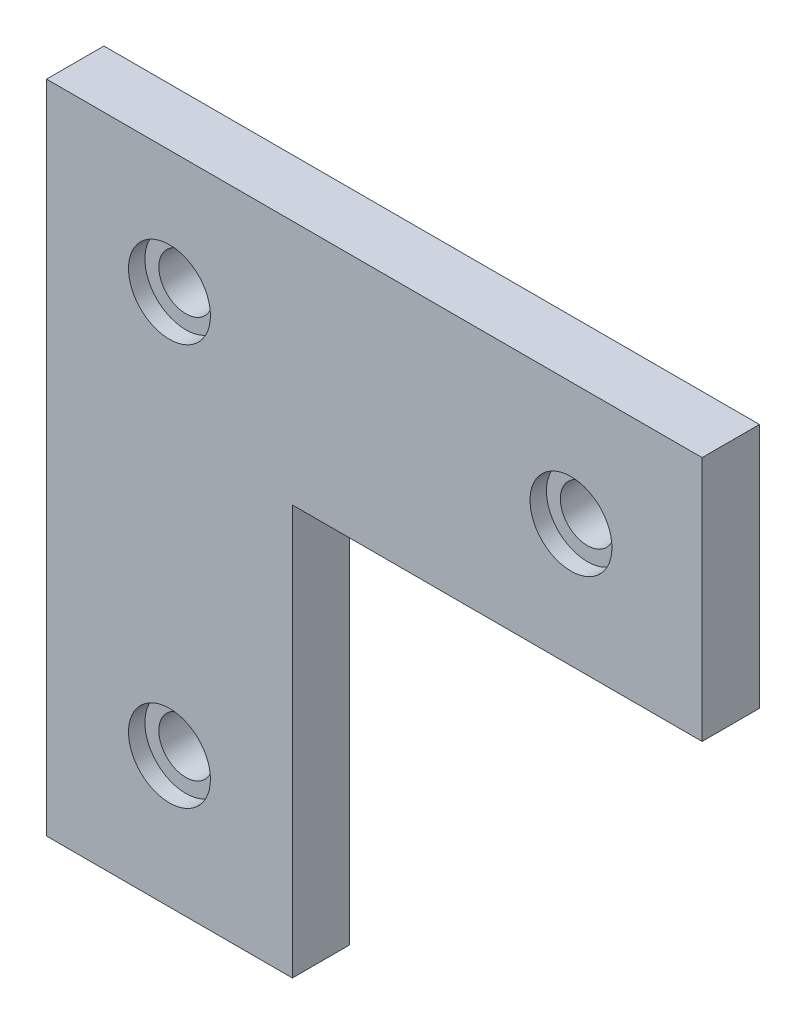
ISO-10303-21;
HEADER;
FILE_DESCRIPTION(('STEP AP214'),'2;1');
FILE_NAME('part.step','',(''),(''),'','','');
FILE_SCHEMA(('AUTOMOTIVE_DESIGN { 1 0 10303 214 1 1 1 1 }'));
ENDSEC;
DATA;
#1=APPLICATION_CONTEXT('core data for automotive mechanical design processes');
#2=APPLICATION_PROTOCOL_DEFINITION('international standard','automotive_design',2000,#1);
#3=PRODUCT_CONTEXT('',#1,'mechanical');
#4=PRODUCT('Part','Part','',(#3));
#5=PRODUCT_RELATED_PRODUCT_CATEGORY('part','',(#4));
#6=PRODUCT_DEFINITION_FORMATION('','',#4);
#7=PRODUCT_DEFINITION_CONTEXT('part definition',#1,'design');
#8=PRODUCT_DEFINITION('design','',#6,#7);
#9=PRODUCT_DEFINITION_SHAPE('','',#8);
#10=(LENGTH_UNIT() NAMED_UNIT(*) SI_UNIT(.MILLI.,.METRE.));
#11=(NAMED_UNIT(*) PLANE_ANGLE_UNIT() SI_UNIT($,.RADIAN.));
#12=(NAMED_UNIT(*) SI_UNIT($,.STERADIAN.) SOLID_ANGLE_UNIT());
#13=UNCERTAINTY_MEASURE_WITH_UNIT(LENGTH_MEASURE(1.E-05),#10,'distance_accuracy_value','');
#14=(GEOMETRIC_REPRESENTATION_CONTEXT(3) GLOBAL_UNCERTAINTY_ASSIGNED_CONTEXT((#13)) GLOBAL_UNIT_ASSIGNED_CONTEXT((#10,
#11,#12)) REPRESENTATION_CONTEXT('',''));
#15=CARTESIAN_POINT('',(0.,0.,0.));
#16=DIRECTION('',(0.,0.,1.));
#17=DIRECTION('',(1.,0.,0.));
#18=AXIS2_PLACEMENT_3D('',#15,#16,#17);
#19=CARTESIAN_POINT('',(0.,20.,3.5));
#20=DIRECTION('',(0.,1.,0.));
#21=DIRECTION('',(-1.,0.,0.));
#22=AXIS2_PLACEMENT_3D('',#19,#20,#21);
#23=PLANE('',#22);
#24=DIRECTION('',(1.,0.,0.));
#25=VECTOR('',#24,1.);
#26=CARTESIAN_POINT('',(0.,20.,0.));
#27=LINE('',#26,#25);
#28=CARTESIAN_POINT('',(-7.5,20.,0.));
#29=VERTEX_POINT('',#28);
#30=CARTESIAN_POINT('',(32.5,20.,0.));
#31=VERTEX_POINT('',#30);
#32=EDGE_CURVE('E126',#29,#31,#27,.T.);
#33=ORIENTED_EDGE('',*,*,#32,.F.);
#34=DIRECTION('',(0.,0.,-1.));
#35=VECTOR('',#34,1.);
#36=CARTESIAN_POINT('',(-7.5,20.,3.5));
#37=LINE('',#36,#35);
#38=CARTESIAN_POINT('',(-7.5,20.,3.5));
#39=VERTEX_POINT('',#38);
#40=EDGE_CURVE('E10',#39,#29,#37,.T.);
#41=ORIENTED_EDGE('',*,*,#40,.F.);
#42=DIRECTION('',(1.,0.,0.));
#43=VECTOR('',#42,1.);
#44=CARTESIAN_POINT('',(0.,20.,3.5));
#45=LINE('',#44,#43);
#46=CARTESIAN_POINT('',(32.5,20.,3.5));
#47=VERTEX_POINT('',#46);
#48=EDGE_CURVE('E144',#39,#47,#45,.T.);
#49=ORIENTED_EDGE('',*,*,#48,.T.);
#50=DIRECTION('',(0.,0.,-1.));
#51=VECTOR('',#50,1.);
#52=CARTESIAN_POINT('',(32.5,20.,3.5));
#53=LINE('',#52,#51);
#54=EDGE_CURVE('E38',#47,#31,#53,.T.);
#55=ORIENTED_EDGE('',*,*,#54,.T.);
#56=EDGE_LOOP('',(#33,#41,#49,#55));
#57=FACE_BOUND('',#56,.T.);
#58=ADVANCED_FACE('F16',(#57),#23,.T.);
#59=CARTESIAN_POINT('',(-7.5,-7.26770060050313,3.5));
#60=DIRECTION('',(1.,0.,0.));
#61=DIRECTION('',(0.,0.,-1.));
#62=AXIS2_PLACEMENT_3D('',#59,#60,#61);
#63=PLANE('',#62);
#64=DIRECTION('',(0.,-1.,0.));
#65=VECTOR('',#64,1.);
#66=CARTESIAN_POINT('',(-7.5,-7.26770060050313,0.));
#67=LINE('',#66,#65);
#68=CARTESIAN_POINT('',(-7.5,-20.,0.));
#69=VERTEX_POINT('',#68);
#70=EDGE_CURVE('E129',#29,#69,#67,.T.);
#71=ORIENTED_EDGE('',*,*,#70,.T.);
#72=DIRECTION('',(0.,0.,-1.));
#73=VECTOR('',#72,1.);
#74=CARTESIAN_POINT('',(-7.5,-20.,3.5));
#75=LINE('',#74,#73);
#76=CARTESIAN_POINT('',(-7.5,-20.,3.5));
#77=VERTEX_POINT('',#76);
#78=EDGE_CURVE('E25',#77,#69,#75,.T.);
#79=ORIENTED_EDGE('',*,*,#78,.F.);
#80=DIRECTION('',(0.,-1.,0.));
#81=VECTOR('',#80,1.);
#82=CARTESIAN_POINT('',(-7.5,-7.26770060050313,3.5));
#83=LINE('',#82,#81);
#84=EDGE_CURVE('E120',#39,#77,#83,.T.);
#85=ORIENTED_EDGE('',*,*,#84,.F.);
#86=ORIENTED_EDGE('',*,*,#40,.T.);
#87=EDGE_LOOP('',(#71,#79,#85,#86));
#88=FACE_BOUND('',#87,.T.);
#89=ADVANCED_FACE('F174',(#88),#63,.F.);
#90=CARTESIAN_POINT('',(0.,-20.,3.5));
#91=DIRECTION('',(0.,1.,0.));
#92=DIRECTION('',(-1.,0.,0.));
#93=AXIS2_PLACEMENT_3D('',#90,#91,#92);
#94=PLANE('',#93);
#95=DIRECTION('',(1.,0.,0.));
#96=VECTOR('',#95,1.);
#97=CARTESIAN_POINT('',(0.,-20.,0.));
#98=LINE('',#97,#96);
#99=CARTESIAN_POINT('',(7.5,-20.,0.));
#100=VERTEX_POINT('',#99);
#101=EDGE_CURVE('E133',#69,#100,#98,.T.);
#102=ORIENTED_EDGE('',*,*,#101,.T.);
#103=DIRECTION('',(0.,0.,-1.));
#104=VECTOR('',#103,1.);
#105=CARTESIAN_POINT('',(7.5,-20.,3.5));
#106=LINE('',#105,#104);
#107=CARTESIAN_POINT('',(7.5,-20.,3.5));
#108=VERTEX_POINT('',#107);
#109=EDGE_CURVE('E100',#108,#100,#106,.T.);
#110=ORIENTED_EDGE('',*,*,#109,.F.);
#111=DIRECTION('',(1.,0.,0.));
#112=VECTOR('',#111,1.);
#113=CARTESIAN_POINT('',(0.,-20.,3.5));
#114=LINE('',#113,#112);
#115=EDGE_CURVE('E112',#77,#108,#114,.T.);
#116=ORIENTED_EDGE('',*,*,#115,.F.);
#117=ORIENTED_EDGE('',*,*,#78,.T.);
#118=EDGE_LOOP('',(#102,#110,#116,#117));
#119=FACE_BOUND('',#118,.T.);
#120=ADVANCED_FACE('F156',(#119),#94,.F.);
#121=CARTESIAN_POINT('',(7.5,-7.26770060050313,3.5));
#122=DIRECTION('',(1.,0.,0.));
#123=DIRECTION('',(0.,0.,-1.));
#124=AXIS2_PLACEMENT_3D('',#121,#122,#123);
#125=PLANE('',#124);
#126=DIRECTION('',(0.,-1.,0.));
#127=VECTOR('',#126,1.);
#128=CARTESIAN_POINT('',(7.5,-7.26770060050313,0.));
#129=LINE('',#128,#127);
#130=CARTESIAN_POINT('',(7.5,5.,0.));
#131=VERTEX_POINT('',#130);
#132=EDGE_CURVE('E96',#131,#100,#129,.T.);
#133=ORIENTED_EDGE('',*,*,#132,.F.);
#134=DIRECTION('',(0.,0.,-1.));
#135=VECTOR('',#134,1.);
#136=CARTESIAN_POINT('',(7.5,5.,3.5));
#137=LINE('',#136,#135);
#138=CARTESIAN_POINT('',(7.5,5.,3.5));
#139=VERTEX_POINT('',#138);
#140=EDGE_CURVE('E90',#139,#131,#137,.T.);
#141=ORIENTED_EDGE('',*,*,#140,.F.);
#142=DIRECTION('',(0.,-1.,0.));
#143=VECTOR('',#142,1.);
#144=CARTESIAN_POINT('',(7.5,-7.26770060050313,3.5));
#145=LINE('',#144,#143);
#146=EDGE_CURVE('E94',#139,#108,#145,.T.);
#147=ORIENTED_EDGE('',*,*,#146,.T.);
#148=ORIENTED_EDGE('',*,*,#109,.T.);
#149=EDGE_LOOP('',(#133,#141,#147,#148));
#150=FACE_BOUND('',#149,.T.);
#151=ADVANCED_FACE('F92',(#150),#125,.T.);
#152=CARTESIAN_POINT('',(19.8275911062956,5.,3.5));
#153=DIRECTION('',(0.,1.,0.));
#154=DIRECTION('',(-1.,0.,0.));
#155=AXIS2_PLACEMENT_3D('',#152,#153,#154);
#156=PLANE('',#155);
#157=DIRECTION('',(1.,0.,0.));
#158=VECTOR('',#157,1.);
#159=CARTESIAN_POINT('',(19.8275911062956,5.,0.));
#160=LINE('',#159,#158);
#161=CARTESIAN_POINT('',(32.5,5.,0.));
#162=VERTEX_POINT('',#161);
#163=EDGE_CURVE('E138',#131,#162,#160,.T.);
#164=ORIENTED_EDGE('',*,*,#163,.T.);
#165=DIRECTION('',(0.,0.,-1.));
#166=VECTOR('',#165,1.);
#167=CARTESIAN_POINT('',(32.5,5.,3.5));
#168=LINE('',#167,#166);
#169=CARTESIAN_POINT('',(32.5,5.,3.5));
#170=VERTEX_POINT('',#169);
#171=EDGE_CURVE('E64',#170,#162,#168,.T.);
#172=ORIENTED_EDGE('',*,*,#171,.F.);
#173=DIRECTION('',(1.,0.,0.));
#174=VECTOR('',#173,1.);
#175=CARTESIAN_POINT('',(19.8275911062956,5.,3.5));
#176=LINE('',#175,#174);
#177=EDGE_CURVE('E102',#139,#170,#176,.T.);
#178=ORIENTED_EDGE('',*,*,#177,.F.);
#179=ORIENTED_EDGE('',*,*,#140,.T.);
#180=EDGE_LOOP('',(#164,#172,#178,#179));
#181=FACE_BOUND('',#180,.T.);
#182=ADVANCED_FACE('F103',(#181),#156,.F.);
#183=CARTESIAN_POINT('',(32.5,7.72158382503776,3.5));
#184=DIRECTION('',(1.,0.,0.));
#185=DIRECTION('',(0.,1.,0.));
#186=AXIS2_PLACEMENT_3D('',#183,#184,#185);
#187=PLANE('',#186);
#188=DIRECTION('',(0.,-1.,0.));
#189=VECTOR('',#188,1.);
#190=CARTESIAN_POINT('',(32.5,7.72158382503776,0.));
#191=LINE('',#190,#189);
#192=EDGE_CURVE('E140',#31,#162,#191,.T.);
#193=ORIENTED_EDGE('',*,*,#192,.F.);
#194=ORIENTED_EDGE('',*,*,#54,.F.);
#195=DIRECTION('',(0.,-1.,0.));
#196=VECTOR('',#195,1.);
#197=CARTESIAN_POINT('',(32.5,7.72158382503776,3.5));
#198=LINE('',#197,#196);
#199=EDGE_CURVE('E107',#47,#170,#198,.T.);
#200=ORIENTED_EDGE('',*,*,#199,.T.);
#201=ORIENTED_EDGE('',*,*,#171,.T.);
#202=EDGE_LOOP('',(#193,#194,#200,#201));
#203=FACE_BOUND('',#202,.T.);
#204=ADVANCED_FACE('F161',(#203),#187,.T.);
#205=CARTESIAN_POINT('',(12.5,0.,3.5));
#206=DIRECTION('',(0.,0.,1.));
#207=DIRECTION('',(1.,0.,0.));
#208=AXIS2_PLACEMENT_3D('',#205,#206,#207);
#209=PLANE('',#208);
#210=CARTESIAN_POINT('',(0.,-12.,3.5));
#211=DIRECTION('',(0.,0.,1.));
#212=DIRECTION('',(1.,0.,0.));
#213=AXIS2_PLACEMENT_3D('',#210,#211,#212);
#214=CIRCLE('',#213,2.5);
#215=CARTESIAN_POINT('',(2.5,-12.,3.5));
#216=VERTEX_POINT('',#215);
#217=EDGE_CURVE('E242',#216,#216,#214,.T.);
#218=ORIENTED_EDGE('',*,*,#217,.F.);
#219=EDGE_LOOP('',(#218));
#220=FACE_BOUND('',#219,.T.);
#221=CARTESIAN_POINT('',(24.5,12.5,3.5));
#222=DIRECTION('',(0.,0.,1.));
#223=DIRECTION('',(1.,0.,0.));
#224=AXIS2_PLACEMENT_3D('',#221,#222,#223);
#225=CIRCLE('',#224,2.5);
#226=CARTESIAN_POINT('',(27.,12.5,3.5));
#227=VERTEX_POINT('',#226);
#228=EDGE_CURVE('E227',#227,#227,#225,.T.);
#229=ORIENTED_EDGE('',*,*,#228,.F.);
#230=EDGE_LOOP('',(#229));
#231=FACE_BOUND('',#230,.T.);
#232=CARTESIAN_POINT('',(0.,12.5,3.5));
#233=DIRECTION('',(0.,0.,1.));
#234=DIRECTION('',(1.,0.,0.));
#235=AXIS2_PLACEMENT_3D('',#232,#233,#234);
#236=CIRCLE('',#235,2.5);
#237=CARTESIAN_POINT('',(2.5,12.5,3.5));
#238=VERTEX_POINT('',#237);
#239=EDGE_CURVE('E234',#238,#238,#236,.T.);
#240=ORIENTED_EDGE('',*,*,#239,.F.);
#241=EDGE_LOOP('',(#240));
#242=FACE_BOUND('',#241,.T.);
#243=ORIENTED_EDGE('',*,*,#48,.F.);
#244=ORIENTED_EDGE('',*,*,#84,.T.);
#245=ORIENTED_EDGE('',*,*,#115,.T.);
#246=ORIENTED_EDGE('',*,*,#146,.F.);
#247=ORIENTED_EDGE('',*,*,#177,.T.);
#248=ORIENTED_EDGE('',*,*,#199,.F.);
#249=EDGE_LOOP('',(#243,#244,#245,#246,#247,#248));
#250=FACE_BOUND('',#249,.T.);
#251=ADVANCED_FACE('F110',(#220,#231,#242,#250),#209,.T.);
#252=CARTESIAN_POINT('',(12.5,0.,0.));
#253=DIRECTION('',(0.,0.,1.));
#254=DIRECTION('',(1.,0.,0.));
#255=AXIS2_PLACEMENT_3D('',#252,#253,#254);
#256=PLANE('',#255);
#257=CARTESIAN_POINT('',(0.,-12.,0.));
#258=DIRECTION('',(0.,0.,1.));
#259=DIRECTION('',(1.,0.,0.));
#260=AXIS2_PLACEMENT_3D('',#257,#258,#259);
#261=CIRCLE('',#260,1.65);
#262=CARTESIAN_POINT('',(1.65,-12.,0.));
#263=VERTEX_POINT('',#262);
#264=EDGE_CURVE('E130',#263,#263,#261,.F.);
#265=ORIENTED_EDGE('',*,*,#264,.F.);
#266=EDGE_LOOP('',(#265));
#267=FACE_BOUND('',#266,.T.);
#268=CARTESIAN_POINT('',(24.5,12.5,0.));
#269=DIRECTION('',(0.,0.,1.));
#270=DIRECTION('',(1.,0.,0.));
#271=AXIS2_PLACEMENT_3D('',#268,#269,#270);
#272=CIRCLE('',#271,1.65);
#273=CARTESIAN_POINT('',(26.15,12.5,0.));
#274=VERTEX_POINT('',#273);
#275=EDGE_CURVE('E204',#274,#274,#272,.F.);
#276=ORIENTED_EDGE('',*,*,#275,.F.);
#277=EDGE_LOOP('',(#276));
#278=FACE_BOUND('',#277,.T.);
#279=CARTESIAN_POINT('',(0.,12.5,0.));
#280=DIRECTION('',(0.,0.,1.));
#281=DIRECTION('',(1.,0.,0.));
#282=AXIS2_PLACEMENT_3D('',#279,#280,#281);
#283=CIRCLE('',#282,1.65);
#284=CARTESIAN_POINT('',(1.65,12.5,0.));
#285=VERTEX_POINT('',#284);
#286=EDGE_CURVE('E209',#285,#285,#283,.F.);
#287=ORIENTED_EDGE('',*,*,#286,.F.);
#288=EDGE_LOOP('',(#287));
#289=FACE_BOUND('',#288,.T.);
#290=ORIENTED_EDGE('',*,*,#32,.T.);
#291=ORIENTED_EDGE('',*,*,#192,.T.);
#292=ORIENTED_EDGE('',*,*,#163,.F.);
#293=ORIENTED_EDGE('',*,*,#132,.T.);
#294=ORIENTED_EDGE('',*,*,#101,.F.);
#295=ORIENTED_EDGE('',*,*,#70,.F.);
#296=EDGE_LOOP('',(#290,#291,#292,#293,#294,#295));
#297=FACE_BOUND('',#296,.T.);
#298=ADVANCED_FACE('F160',(#267,#278,#289,#297),#256,.F.);
#299=CARTESIAN_POINT('',(0.,12.5,-500000.));
#300=DIRECTION('',(0.,0.,1.));
#301=DIRECTION('',(1.,0.,0.));
#302=AXIS2_PLACEMENT_3D('',#299,#300,#301);
#303=CYLINDRICAL_SURFACE('',#302,1.65);
#304=CARTESIAN_POINT('',(0.,12.5,2.5));
#305=DIRECTION('',(0.,0.,1.));
#306=DIRECTION('',(1.,0.,0.));
#307=AXIS2_PLACEMENT_3D('',#304,#305,#306);
#308=CIRCLE('',#307,1.65);
#309=CARTESIAN_POINT('',(1.65,12.5,2.5));
#310=VERTEX_POINT('',#309);
#311=EDGE_CURVE('E237',#310,#310,#308,.T.);
#312=ORIENTED_EDGE('',*,*,#311,.T.);
#313=EDGE_LOOP('',(#312));
#314=FACE_BOUND('',#313,.T.);
#315=ORIENTED_EDGE('',*,*,#286,.T.);
#316=EDGE_LOOP('',(#315));
#317=FACE_BOUND('',#316,.T.);
#318=ADVANCED_FACE('F219',(#314,#317),#303,.F.);
#319=CARTESIAN_POINT('',(24.5,12.5,-500000.));
#320=DIRECTION('',(0.,0.,1.));
#321=DIRECTION('',(1.,0.,0.));
#322=AXIS2_PLACEMENT_3D('',#319,#320,#321);
#323=CYLINDRICAL_SURFACE('',#322,1.65);
#324=CARTESIAN_POINT('',(24.5,12.5,2.5));
#325=DIRECTION('',(0.,0.,1.));
#326=DIRECTION('',(1.,0.,0.));
#327=AXIS2_PLACEMENT_3D('',#324,#325,#326);
#328=CIRCLE('',#327,1.65);
#329=CARTESIAN_POINT('',(26.15,12.5,2.5));
#330=VERTEX_POINT('',#329);
#331=EDGE_CURVE('E230',#330,#330,#328,.T.);
#332=ORIENTED_EDGE('',*,*,#331,.T.);
#333=EDGE_LOOP('',(#332));
#334=FACE_BOUND('',#333,.T.);
#335=ORIENTED_EDGE('',*,*,#275,.T.);
#336=EDGE_LOOP('',(#335));
#337=FACE_BOUND('',#336,.T.);
#338=ADVANCED_FACE('F313',(#334,#337),#323,.F.);
#339=CARTESIAN_POINT('',(0.,-12.,-500000.));
#340=DIRECTION('',(0.,0.,1.));
#341=DIRECTION('',(1.,0.,0.));
#342=AXIS2_PLACEMENT_3D('',#339,#340,#341);
#343=CYLINDRICAL_SURFACE('',#342,1.65);
#344=CARTESIAN_POINT('',(0.,-12.,2.5));
#345=DIRECTION('',(0.,0.,1.));
#346=DIRECTION('',(1.,0.,0.));
#347=AXIS2_PLACEMENT_3D('',#344,#345,#346);
#348=CIRCLE('',#347,1.65);
#349=CARTESIAN_POINT('',(1.65,-12.,2.5));
#350=VERTEX_POINT('',#349);
#351=EDGE_CURVE('E223',#350,#350,#348,.T.);
#352=ORIENTED_EDGE('',*,*,#351,.T.);
#353=EDGE_LOOP('',(#352));
#354=FACE_BOUND('',#353,.T.);
#355=ORIENTED_EDGE('',*,*,#264,.T.);
#356=EDGE_LOOP('',(#355));
#357=FACE_BOUND('',#356,.T.);
#358=ADVANCED_FACE('F296',(#354,#357),#343,.F.);
#359=CARTESIAN_POINT('',(0.,-12.,2.5));
#360=DIRECTION('',(0.,0.,1.));
#361=DIRECTION('',(1.,0.,0.));
#362=AXIS2_PLACEMENT_3D('',#359,#360,#361);
#363=CYLINDRICAL_SURFACE('',#362,2.5);
#364=CARTESIAN_POINT('',(0.,-12.,2.5));
#365=DIRECTION('',(0.,0.,1.));
#366=DIRECTION('',(1.,0.,0.));
#367=AXIS2_PLACEMENT_3D('',#364,#365,#366);
#368=CIRCLE('',#367,2.5);
#369=CARTESIAN_POINT('',(2.5,-12.,2.5));
#370=VERTEX_POINT('',#369);
#371=EDGE_CURVE('E228',#370,#370,#368,.T.);
#372=ORIENTED_EDGE('',*,*,#371,.F.);
#373=EDGE_LOOP('',(#372));
#374=FACE_BOUND('',#373,.T.);
#375=ORIENTED_EDGE('',*,*,#217,.T.);
#376=EDGE_LOOP('',(#375));
#377=FACE_BOUND('',#376,.T.);
#378=ADVANCED_FACE('F272',(#374,#377),#363,.F.);
#379=CARTESIAN_POINT('',(12.5,0.,2.5));
#380=DIRECTION('',(0.,0.,1.));
#381=DIRECTION('',(1.,0.,0.));
#382=AXIS2_PLACEMENT_3D('',#379,#380,#381);
#383=PLANE('',#382);
#384=ORIENTED_EDGE('',*,*,#351,.F.);
#385=EDGE_LOOP('',(#384));
#386=FACE_BOUND('',#385,.T.);
#387=ORIENTED_EDGE('',*,*,#371,.T.);
#388=EDGE_LOOP('',(#387));
#389=FACE_BOUND('',#388,.T.);
#390=ADVANCED_FACE('F267',(#386,#389),#383,.T.);
#391=CARTESIAN_POINT('',(24.5,12.5,2.5));
#392=DIRECTION('',(0.,0.,1.));
#393=DIRECTION('',(1.,0.,0.));
#394=AXIS2_PLACEMENT_3D('',#391,#392,#393);
#395=CYLINDRICAL_SURFACE('',#394,2.5);
#396=CARTESIAN_POINT('',(24.5,12.5,2.5));
#397=DIRECTION('',(0.,0.,1.));
#398=DIRECTION('',(1.,0.,0.));
#399=AXIS2_PLACEMENT_3D('',#396,#397,#398);
#400=CIRCLE('',#399,2.5);
#401=CARTESIAN_POINT('',(27.,12.5,2.5));
#402=VERTEX_POINT('',#401);
#403=EDGE_CURVE('E235',#402,#402,#400,.T.);
#404=ORIENTED_EDGE('',*,*,#403,.F.);
#405=EDGE_LOOP('',(#404));
#406=FACE_BOUND('',#405,.T.);
#407=ORIENTED_EDGE('',*,*,#228,.T.);
#408=EDGE_LOOP('',(#407));
#409=FACE_BOUND('',#408,.T.);
#410=ADVANCED_FACE('F271',(#406,#409),#395,.F.);
#411=CARTESIAN_POINT('',(12.5,0.,2.5));
#412=DIRECTION('',(0.,0.,1.));
#413=DIRECTION('',(1.,0.,0.));
#414=AXIS2_PLACEMENT_3D('',#411,#412,#413);
#415=PLANE('',#414);
#416=ORIENTED_EDGE('',*,*,#331,.F.);
#417=EDGE_LOOP('',(#416));
#418=FACE_BOUND('',#417,.T.);
#419=ORIENTED_EDGE('',*,*,#403,.T.);
#420=EDGE_LOOP('',(#419));
#421=FACE_BOUND('',#420,.T.);
#422=ADVANCED_FACE('F278',(#418,#421),#415,.T.);
#423=CARTESIAN_POINT('',(0.,12.5,2.5));
#424=DIRECTION('',(0.,0.,1.));
#425=DIRECTION('',(1.,0.,0.));
#426=AXIS2_PLACEMENT_3D('',#423,#424,#425);
#427=CYLINDRICAL_SURFACE('',#426,2.5);
#428=CARTESIAN_POINT('',(0.,12.5,2.5));
#429=DIRECTION('',(0.,0.,1.));
#430=DIRECTION('',(1.,0.,0.));
#431=AXIS2_PLACEMENT_3D('',#428,#429,#430);
#432=CIRCLE('',#431,2.5);
#433=CARTESIAN_POINT('',(2.5,12.5,2.5));
#434=VERTEX_POINT('',#433);
#435=EDGE_CURVE('E214',#434,#434,#432,.T.);
#436=ORIENTED_EDGE('',*,*,#435,.F.);
#437=EDGE_LOOP('',(#436));
#438=FACE_BOUND('',#437,.T.);
#439=ORIENTED_EDGE('',*,*,#239,.T.);
#440=EDGE_LOOP('',(#439));
#441=FACE_BOUND('',#440,.T.);
#442=ADVANCED_FACE('F282',(#438,#441),#427,.F.);
#443=CARTESIAN_POINT('',(12.5,0.,2.5));
#444=DIRECTION('',(0.,0.,1.));
#445=DIRECTION('',(1.,0.,0.));
#446=AXIS2_PLACEMENT_3D('',#443,#444,#445);
#447=PLANE('',#446);
#448=ORIENTED_EDGE('',*,*,#311,.F.);
#449=EDGE_LOOP('',(#448));
#450=FACE_BOUND('',#449,.T.);
#451=ORIENTED_EDGE('',*,*,#435,.T.);
#452=EDGE_LOOP('',(#451));
#453=FACE_BOUND('',#452,.T.);
#454=ADVANCED_FACE('F287',(#450,#453),#447,.T.);
#455=CLOSED_SHELL('',(#58,#89,#120,#151,#182,#204,#251,#298,#318,#338,#358,#378,#390,#410,#422,
#442,#454));
#456=MANIFOLD_SOLID_BREP('B1',#455);
#457=ADVANCED_BREP_SHAPE_REPRESENTATION('',(#18,#456),#14);
#458=SHAPE_DEFINITION_REPRESENTATION(#9,#457);
ENDSEC;
END-ISO-10303-21;
